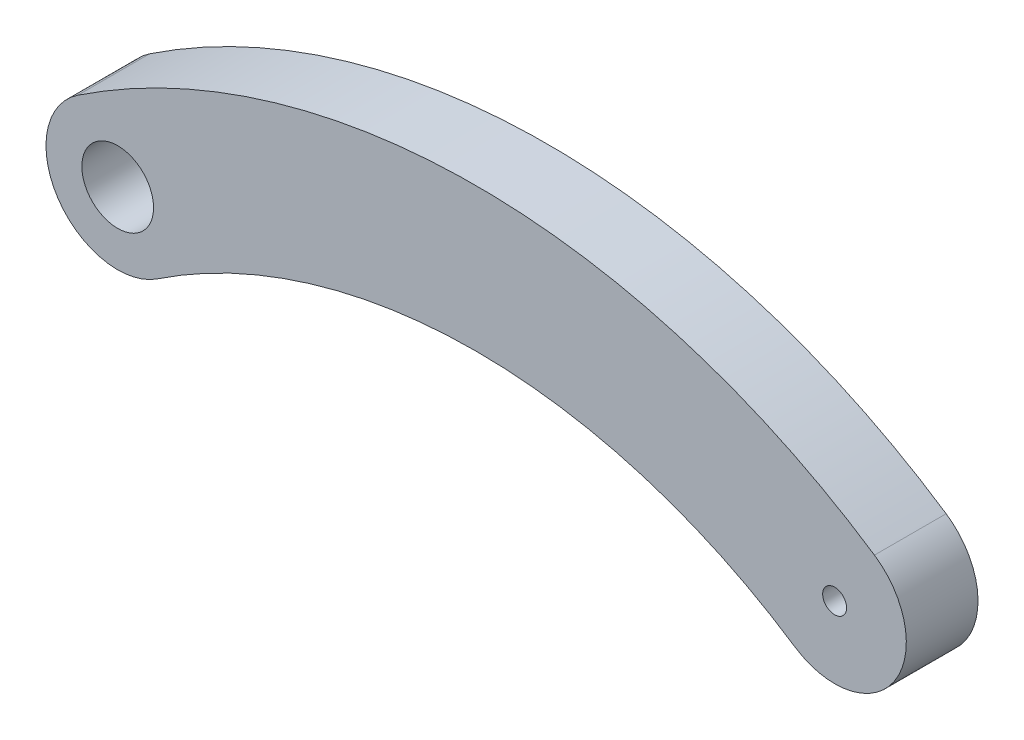
ISO-10303-21;
HEADER;
FILE_DESCRIPTION(('STEP AP214'),'2;1');
FILE_NAME('part.step','',(''),(''),'','','');
FILE_SCHEMA(('AUTOMOTIVE_DESIGN { 1 0 10303 214 1 1 1 1 }'));
ENDSEC;
DATA;
#1=APPLICATION_CONTEXT('core data for automotive mechanical design processes');
#2=APPLICATION_PROTOCOL_DEFINITION('international standard','automotive_design',2000,#1);
#3=PRODUCT_CONTEXT('',#1,'mechanical');
#4=PRODUCT('Part','Part','',(#3));
#5=PRODUCT_RELATED_PRODUCT_CATEGORY('part','',(#4));
#6=PRODUCT_DEFINITION_FORMATION('','',#4);
#7=PRODUCT_DEFINITION_CONTEXT('part definition',#1,'design');
#8=PRODUCT_DEFINITION('design','',#6,#7);
#9=PRODUCT_DEFINITION_SHAPE('','',#8);
#10=(LENGTH_UNIT() NAMED_UNIT(*) SI_UNIT(.MILLI.,.METRE.));
#11=(NAMED_UNIT(*) PLANE_ANGLE_UNIT() SI_UNIT($,.RADIAN.));
#12=(NAMED_UNIT(*) SI_UNIT($,.STERADIAN.) SOLID_ANGLE_UNIT());
#13=UNCERTAINTY_MEASURE_WITH_UNIT(LENGTH_MEASURE(1.E-05),#10,'distance_accuracy_value','');
#14=(GEOMETRIC_REPRESENTATION_CONTEXT(3) GLOBAL_UNCERTAINTY_ASSIGNED_CONTEXT((#13)) GLOBAL_UNIT_ASSIGNED_CONTEXT((#10,
#11,#12)) REPRESENTATION_CONTEXT('',''));
#15=CARTESIAN_POINT('',(0.,0.,0.));
#16=DIRECTION('',(0.,0.,1.));
#17=DIRECTION('',(1.,0.,0.));
#18=AXIS2_PLACEMENT_3D('',#15,#16,#17);
#19=CARTESIAN_POINT('',(7.5,-11.2249721603218,3.));
#20=DIRECTION('',(0.,0.,1.));
#21=DIRECTION('',(1.,0.,0.));
#22=AXIS2_PLACEMENT_3D('',#19,#20,#21);
#23=PLANE('',#22);
#24=CARTESIAN_POINT('',(0.,0.,3.));
#25=DIRECTION('',(0.,0.,1.));
#26=DIRECTION('',(1.,0.,0.));
#27=AXIS2_PLACEMENT_3D('',#24,#25,#26);
#28=CIRCLE('',#27,1.5);
#29=CARTESIAN_POINT('',(1.5,0.,3.));
#30=VERTEX_POINT('',#29);
#31=EDGE_CURVE('E101',#30,#30,#28,.T.);
#32=ORIENTED_EDGE('',*,*,#31,.F.);
#33=EDGE_LOOP('',(#32));
#34=FACE_BOUND('',#33,.T.);
#35=CARTESIAN_POINT('',(15.,-22.4499443206436,3.));
#36=DIRECTION('',(0.,0.,-1.));
#37=DIRECTION('',(1.,0.,0.));
#38=AXIS2_PLACEMENT_3D('',#35,#36,#37);
#39=CIRCLE('',#38,24.);
#40=CARTESIAN_POINT('',(1.66666666666667,-2.4944382578493,3.));
#41=VERTEX_POINT('',#40);
#42=CARTESIAN_POINT('',(28.3333333333333,-2.49443825784929,3.));
#43=VERTEX_POINT('',#42);
#44=EDGE_CURVE('E86',#41,#43,#39,.T.);
#45=ORIENTED_EDGE('',*,*,#44,.T.);
#46=CARTESIAN_POINT('',(30.,0.,3.));
#47=DIRECTION('',(0.,0.,1.));
#48=DIRECTION('',(1.,0.,0.));
#49=AXIS2_PLACEMENT_3D('',#46,#47,#48);
#50=CIRCLE('',#49,3.);
#51=CARTESIAN_POINT('',(31.6666666666667,2.4944382578493,3.));
#52=VERTEX_POINT('',#51);
#53=EDGE_CURVE('E81',#43,#52,#50,.T.);
#54=ORIENTED_EDGE('',*,*,#53,.T.);
#55=CARTESIAN_POINT('',(15.,-22.4499443206436,3.));
#56=DIRECTION('',(0.,0.,1.));
#57=DIRECTION('',(1.,0.,0.));
#58=AXIS2_PLACEMENT_3D('',#55,#56,#57);
#59=CIRCLE('',#58,30.);
#60=CARTESIAN_POINT('',(-1.66666666666667,2.4944382578493,3.));
#61=VERTEX_POINT('',#60);
#62=EDGE_CURVE('E84',#52,#61,#59,.T.);
#63=ORIENTED_EDGE('',*,*,#62,.T.);
#64=CARTESIAN_POINT('',(0.,0.,3.));
#65=DIRECTION('',(0.,0.,1.));
#66=DIRECTION('',(1.,0.,0.));
#67=AXIS2_PLACEMENT_3D('',#64,#65,#66);
#68=CIRCLE('',#67,3.);
#69=EDGE_CURVE('E51',#61,#41,#68,.T.);
#70=ORIENTED_EDGE('',*,*,#69,.T.);
#71=EDGE_LOOP('',(#45,#54,#63,#70));
#72=FACE_BOUND('',#71,.T.);
#73=CARTESIAN_POINT('',(30.,0.,3.));
#74=DIRECTION('',(0.,0.,1.));
#75=DIRECTION('',(1.,0.,0.));
#76=AXIS2_PLACEMENT_3D('',#73,#74,#75);
#77=CIRCLE('',#76,0.499999999999999);
#78=CARTESIAN_POINT('',(30.5,0.,3.));
#79=VERTEX_POINT('',#78);
#80=EDGE_CURVE('E119',#79,#79,#77,.T.);
#81=ORIENTED_EDGE('',*,*,#80,.F.);
#82=EDGE_LOOP('',(#81));
#83=FACE_BOUND('',#82,.T.);
#84=ADVANCED_FACE('F34',(#34,#72,#83),#23,.T.);
#85=CARTESIAN_POINT('',(7.5,-11.2249721603218,0.));
#86=DIRECTION('',(0.,0.,1.));
#87=DIRECTION('',(1.,0.,0.));
#88=AXIS2_PLACEMENT_3D('',#85,#86,#87);
#89=PLANE('',#88);
#90=CARTESIAN_POINT('',(15.,-22.4499443206436,0.));
#91=DIRECTION('',(0.,0.,-1.));
#92=DIRECTION('',(1.,0.,0.));
#93=AXIS2_PLACEMENT_3D('',#90,#91,#92);
#94=CIRCLE('',#93,24.);
#95=CARTESIAN_POINT('',(1.66666666666667,-2.4944382578493,0.));
#96=VERTEX_POINT('',#95);
#97=CARTESIAN_POINT('',(28.3333333333333,-2.49443825784929,0.));
#98=VERTEX_POINT('',#97);
#99=EDGE_CURVE('E98',#96,#98,#94,.T.);
#100=ORIENTED_EDGE('',*,*,#99,.F.);
#101=CARTESIAN_POINT('',(0.,0.,0.));
#102=DIRECTION('',(0.,0.,1.));
#103=DIRECTION('',(1.,0.,0.));
#104=AXIS2_PLACEMENT_3D('',#101,#102,#103);
#105=CIRCLE('',#104,3.);
#106=CARTESIAN_POINT('',(-1.66666666666667,2.4944382578493,0.));
#107=VERTEX_POINT('',#106);
#108=EDGE_CURVE('E74',#107,#96,#105,.T.);
#109=ORIENTED_EDGE('',*,*,#108,.F.);
#110=CARTESIAN_POINT('',(15.,-22.4499443206436,0.));
#111=DIRECTION('',(0.,0.,1.));
#112=DIRECTION('',(1.,0.,0.));
#113=AXIS2_PLACEMENT_3D('',#110,#111,#112);
#114=CIRCLE('',#113,30.);
#115=CARTESIAN_POINT('',(31.6666666666667,2.4944382578493,0.));
#116=VERTEX_POINT('',#115);
#117=EDGE_CURVE('E68',#116,#107,#114,.T.);
#118=ORIENTED_EDGE('',*,*,#117,.F.);
#119=CARTESIAN_POINT('',(30.,0.,0.));
#120=DIRECTION('',(0.,0.,1.));
#121=DIRECTION('',(1.,0.,0.));
#122=AXIS2_PLACEMENT_3D('',#119,#120,#121);
#123=CIRCLE('',#122,3.);
#124=EDGE_CURVE('E90',#98,#116,#123,.T.);
#125=ORIENTED_EDGE('',*,*,#124,.F.);
#126=EDGE_LOOP('',(#100,#109,#118,#125));
#127=FACE_BOUND('',#126,.T.);
#128=CARTESIAN_POINT('',(0.,0.,0.));
#129=DIRECTION('',(0.,0.,1.));
#130=DIRECTION('',(1.,0.,0.));
#131=AXIS2_PLACEMENT_3D('',#128,#129,#130);
#132=CIRCLE('',#131,1.5);
#133=CARTESIAN_POINT('',(1.5,0.,0.));
#134=VERTEX_POINT('',#133);
#135=EDGE_CURVE('E113',#134,#134,#132,.T.);
#136=ORIENTED_EDGE('',*,*,#135,.T.);
#137=EDGE_LOOP('',(#136));
#138=FACE_BOUND('',#137,.T.);
#139=CARTESIAN_POINT('',(30.,0.,0.));
#140=DIRECTION('',(0.,0.,1.));
#141=DIRECTION('',(1.,0.,0.));
#142=AXIS2_PLACEMENT_3D('',#139,#140,#141);
#143=CIRCLE('',#142,0.499999999999999);
#144=CARTESIAN_POINT('',(30.5,0.,0.));
#145=VERTEX_POINT('',#144);
#146=EDGE_CURVE('E116',#145,#145,#143,.T.);
#147=ORIENTED_EDGE('',*,*,#146,.T.);
#148=EDGE_LOOP('',(#147));
#149=FACE_BOUND('',#148,.T.);
#150=ADVANCED_FACE('F109',(#127,#138,#149),#89,.F.);
#151=CARTESIAN_POINT('',(15.,-22.4499443206436,3.));
#152=DIRECTION('',(0.,0.,-1.));
#153=DIRECTION('',(-1.,0.,0.));
#154=AXIS2_PLACEMENT_3D('',#151,#152,#153);
#155=CYLINDRICAL_SURFACE('',#154,24.);
#156=ORIENTED_EDGE('',*,*,#99,.T.);
#157=DIRECTION('',(0.,0.,-1.));
#158=VECTOR('',#157,1.);
#159=CARTESIAN_POINT('',(28.3333333333333,-2.49443825784929,3.));
#160=LINE('',#159,#158);
#161=EDGE_CURVE('E11',#43,#98,#160,.T.);
#162=ORIENTED_EDGE('',*,*,#161,.F.);
#163=ORIENTED_EDGE('',*,*,#44,.F.);
#164=DIRECTION('',(0.,0.,-1.));
#165=VECTOR('',#164,1.);
#166=CARTESIAN_POINT('',(1.66666666666667,-2.4944382578493,3.));
#167=LINE('',#166,#165);
#168=EDGE_CURVE('E94',#41,#96,#167,.T.);
#169=ORIENTED_EDGE('',*,*,#168,.T.);
#170=EDGE_LOOP('',(#156,#162,#163,#169));
#171=FACE_BOUND('',#170,.T.);
#172=ADVANCED_FACE('F36',(#171),#155,.F.);
#173=CARTESIAN_POINT('',(30.,0.,3.));
#174=DIRECTION('',(0.,0.,-1.));
#175=DIRECTION('',(-1.,0.,0.));
#176=AXIS2_PLACEMENT_3D('',#173,#174,#175);
#177=CYLINDRICAL_SURFACE('',#176,3.);
#178=ORIENTED_EDGE('',*,*,#124,.T.);
#179=DIRECTION('',(0.,0.,-1.));
#180=VECTOR('',#179,1.);
#181=CARTESIAN_POINT('',(31.6666666666667,2.4944382578493,3.));
#182=LINE('',#181,#180);
#183=EDGE_CURVE('E43',#52,#116,#182,.T.);
#184=ORIENTED_EDGE('',*,*,#183,.F.);
#185=ORIENTED_EDGE('',*,*,#53,.F.);
#186=ORIENTED_EDGE('',*,*,#161,.T.);
#187=EDGE_LOOP('',(#178,#184,#185,#186));
#188=FACE_BOUND('',#187,.T.);
#189=ADVANCED_FACE('F89',(#188),#177,.T.);
#190=CARTESIAN_POINT('',(15.,-22.4499443206436,3.));
#191=DIRECTION('',(0.,0.,-1.));
#192=DIRECTION('',(-1.,0.,0.));
#193=AXIS2_PLACEMENT_3D('',#190,#191,#192);
#194=CYLINDRICAL_SURFACE('',#193,30.);
#195=ORIENTED_EDGE('',*,*,#117,.T.);
#196=DIRECTION('',(0.,0.,-1.));
#197=VECTOR('',#196,1.);
#198=CARTESIAN_POINT('',(-1.66666666666667,2.4944382578493,3.));
#199=LINE('',#198,#197);
#200=EDGE_CURVE('E91',#61,#107,#199,.T.);
#201=ORIENTED_EDGE('',*,*,#200,.F.);
#202=ORIENTED_EDGE('',*,*,#62,.F.);
#203=ORIENTED_EDGE('',*,*,#183,.T.);
#204=EDGE_LOOP('',(#195,#201,#202,#203));
#205=FACE_BOUND('',#204,.T.);
#206=ADVANCED_FACE('F92',(#205),#194,.T.);
#207=CARTESIAN_POINT('',(0.,0.,3.));
#208=DIRECTION('',(0.,0.,-1.));
#209=DIRECTION('',(-1.,0.,0.));
#210=AXIS2_PLACEMENT_3D('',#207,#208,#209);
#211=CYLINDRICAL_SURFACE('',#210,3.);
#212=ORIENTED_EDGE('',*,*,#108,.T.);
#213=ORIENTED_EDGE('',*,*,#168,.F.);
#214=ORIENTED_EDGE('',*,*,#69,.F.);
#215=ORIENTED_EDGE('',*,*,#200,.T.);
#216=EDGE_LOOP('',(#212,#213,#214,#215));
#217=FACE_BOUND('',#216,.T.);
#218=ADVANCED_FACE('F106',(#217),#211,.T.);
#219=CARTESIAN_POINT('',(0.,0.,3.));
#220=DIRECTION('',(0.,0.,-1.));
#221=DIRECTION('',(-1.,0.,0.));
#222=AXIS2_PLACEMENT_3D('',#219,#220,#221);
#223=CYLINDRICAL_SURFACE('',#222,1.5);
#224=ORIENTED_EDGE('',*,*,#31,.T.);
#225=EDGE_LOOP('',(#224));
#226=FACE_BOUND('',#225,.T.);
#227=ORIENTED_EDGE('',*,*,#135,.F.);
#228=EDGE_LOOP('',(#227));
#229=FACE_BOUND('',#228,.T.);
#230=ADVANCED_FACE('F129',(#226,#229),#223,.F.);
#231=CARTESIAN_POINT('',(30.,0.,0.));
#232=DIRECTION('',(0.,0.,1.));
#233=DIRECTION('',(1.,0.,0.));
#234=AXIS2_PLACEMENT_3D('',#231,#232,#233);
#235=CYLINDRICAL_SURFACE('',#234,0.499999999999999);
#236=ORIENTED_EDGE('',*,*,#146,.F.);
#237=EDGE_LOOP('',(#236));
#238=FACE_BOUND('',#237,.T.);
#239=ORIENTED_EDGE('',*,*,#80,.T.);
#240=EDGE_LOOP('',(#239));
#241=FACE_BOUND('',#240,.T.);
#242=ADVANCED_FACE('F126',(#238,#241),#235,.F.);
#243=CLOSED_SHELL('',(#84,#150,#172,#189,#206,#218,#230,#242));
#244=MANIFOLD_SOLID_BREP('B2',#243);
#245=ADVANCED_BREP_SHAPE_REPRESENTATION('',(#18,#244),#14);
#246=SHAPE_DEFINITION_REPRESENTATION(#9,#245);
ENDSEC;
END-ISO-10303-21;
